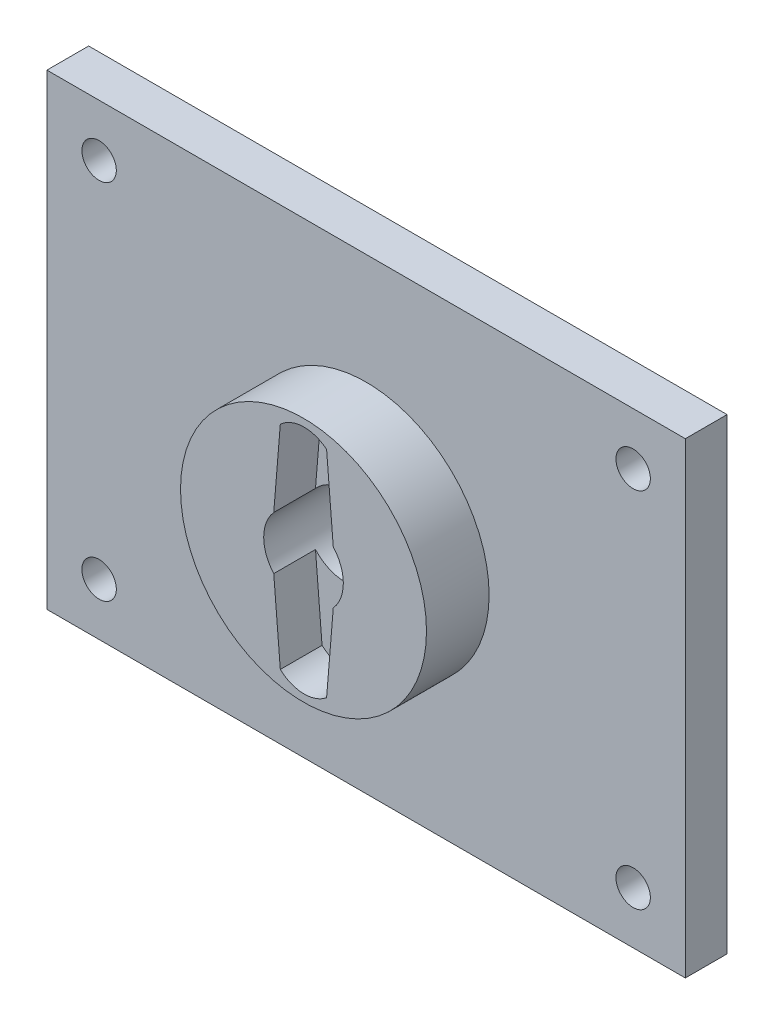
ISO-10303-21;
HEADER;
FILE_DESCRIPTION(('STEP AP214'),'2;1');
FILE_NAME('part.step','',(''),(''),'','','');
FILE_SCHEMA(('AUTOMOTIVE_DESIGN { 1 0 10303 214 1 1 1 1 }'));
ENDSEC;
DATA;
#1=APPLICATION_CONTEXT('core data for automotive mechanical design processes');
#2=APPLICATION_PROTOCOL_DEFINITION('international standard','automotive_design',2000,#1);
#3=PRODUCT_CONTEXT('',#1,'mechanical');
#4=PRODUCT('Part','Part','',(#3));
#5=PRODUCT_RELATED_PRODUCT_CATEGORY('part','',(#4));
#6=PRODUCT_DEFINITION_FORMATION('','',#4);
#7=PRODUCT_DEFINITION_CONTEXT('part definition',#1,'design');
#8=PRODUCT_DEFINITION('design','',#6,#7);
#9=PRODUCT_DEFINITION_SHAPE('','',#8);
#10=(LENGTH_UNIT() NAMED_UNIT(*) SI_UNIT(.MILLI.,.METRE.));
#11=(NAMED_UNIT(*) PLANE_ANGLE_UNIT() SI_UNIT($,.RADIAN.));
#12=(NAMED_UNIT(*) SI_UNIT($,.STERADIAN.) SOLID_ANGLE_UNIT());
#13=UNCERTAINTY_MEASURE_WITH_UNIT(LENGTH_MEASURE(1.E-05),#10,'distance_accuracy_value','');
#14=(GEOMETRIC_REPRESENTATION_CONTEXT(3) GLOBAL_UNCERTAINTY_ASSIGNED_CONTEXT((#13)) GLOBAL_UNIT_ASSIGNED_CONTEXT((#10,
#11,#12)) REPRESENTATION_CONTEXT('',''));
#15=CARTESIAN_POINT('',(0.,0.,0.));
#16=DIRECTION('',(0.,0.,1.));
#17=DIRECTION('',(1.,0.,0.));
#18=AXIS2_PLACEMENT_3D('',#15,#16,#17);
#19=CARTESIAN_POINT('',(-2.22302973270381,-10.1764153104196,6.));
#20=DIRECTION('',(-0.996638952948471,-0.0819194571867707,0.));
#21=DIRECTION('',(0.0819194571867707,-0.996638952948471,0.));
#22=AXIS2_PLACEMENT_3D('',#19,#20,#21);
#23=PLANE('',#22);
#24=DIRECTION('',(0.,0.,-1.));
#25=VECTOR('',#24,1.);
#26=CARTESIAN_POINT('',(-2.85106761194265,-2.53565405696655,10.));
#27=LINE('',#26,#25);
#28=CARTESIAN_POINT('',(-2.85106761194265,-2.53565405696655,10.));
#29=VERTEX_POINT('',#28);
#30=CARTESIAN_POINT('',(-2.85106761194265,-2.53565405696655,6.));
#31=VERTEX_POINT('',#30);
#32=EDGE_CURVE('E530',#29,#31,#27,.T.);
#33=ORIENTED_EDGE('',*,*,#32,.F.);
#34=DIRECTION('',(0.0819194571867707,-0.996638952948471,0.));
#35=VECTOR('',#34,1.);
#36=CARTESIAN_POINT('',(-2.22302973270381,-10.1764153104196,10.));
#37=LINE('',#36,#35);
#38=CARTESIAN_POINT('',(-2.22302973270381,-10.1764153104196,10.));
#39=VERTEX_POINT('',#38);
#40=EDGE_CURVE('E175',#29,#39,#37,.T.);
#41=ORIENTED_EDGE('',*,*,#40,.T.);
#42=DIRECTION('',(0.,0.,1.));
#43=VECTOR('',#42,1.);
#44=CARTESIAN_POINT('',(-2.22302973270381,-10.1764153104196,6.));
#45=LINE('',#44,#43);
#46=CARTESIAN_POINT('',(-2.22302973270381,-10.1764153104196,6.));
#47=VERTEX_POINT('',#46);
#48=EDGE_CURVE('E179',#47,#39,#45,.T.);
#49=ORIENTED_EDGE('',*,*,#48,.F.);
#50=DIRECTION('',(0.0819194571867707,-0.996638952948471,0.));
#51=VECTOR('',#50,1.);
#52=CARTESIAN_POINT('',(-2.22302973270381,-10.1764153104196,6.));
#53=LINE('',#52,#51);
#54=EDGE_CURVE('E192',#31,#47,#53,.T.);
#55=ORIENTED_EDGE('',*,*,#54,.F.);
#56=EDGE_LOOP('',(#33,#41,#49,#55));
#57=FACE_BOUND('',#56,.T.);
#58=ADVANCED_FACE('F43',(#57),#23,.F.);
#59=CARTESIAN_POINT('',(-2.22302973270416,10.1764153104192,6.));
#60=DIRECTION('',(-0.996638952948475,0.0819194571867297,0.));
#61=DIRECTION('',(-0.0819194571867297,-0.996638952948474,0.));
#62=AXIS2_PLACEMENT_3D('',#59,#60,#61);
#63=PLANE('',#62);
#64=DIRECTION('',(0.,0.,-1.));
#65=VECTOR('',#64,1.);
#66=CARTESIAN_POINT('',(-2.85106761194267,2.53565405696654,10.));
#67=LINE('',#66,#65);
#68=CARTESIAN_POINT('',(-2.85106761194266,2.53565405696654,6.));
#69=VERTEX_POINT('',#68);
#70=CARTESIAN_POINT('',(-2.85106761194266,2.53565405696654,10.));
#71=VERTEX_POINT('',#70);
#72=EDGE_CURVE('E153',#69,#71,#67,.F.);
#73=ORIENTED_EDGE('',*,*,#72,.F.);
#74=DIRECTION('',(-0.0819194571867297,-0.996638952948474,0.));
#75=VECTOR('',#74,1.);
#76=CARTESIAN_POINT('',(-2.22302973270416,10.1764153104192,6.));
#77=LINE('',#76,#75);
#78=CARTESIAN_POINT('',(-2.22302973270416,10.1764153104192,6.));
#79=VERTEX_POINT('',#78);
#80=EDGE_CURVE('E546',#79,#69,#77,.T.);
#81=ORIENTED_EDGE('',*,*,#80,.F.);
#82=DIRECTION('',(0.,0.,1.));
#83=VECTOR('',#82,1.);
#84=CARTESIAN_POINT('',(-2.22302973270416,10.1764153104192,6.));
#85=LINE('',#84,#83);
#86=CARTESIAN_POINT('',(-2.22302973270416,10.1764153104192,10.));
#87=VERTEX_POINT('',#86);
#88=EDGE_CURVE('E183',#79,#87,#85,.T.);
#89=ORIENTED_EDGE('',*,*,#88,.T.);
#90=DIRECTION('',(-0.0819194571867297,-0.996638952948474,0.));
#91=VECTOR('',#90,1.);
#92=CARTESIAN_POINT('',(-2.22302973270416,10.1764153104192,10.));
#93=LINE('',#92,#91);
#94=EDGE_CURVE('E167',#87,#71,#93,.T.);
#95=ORIENTED_EDGE('',*,*,#94,.T.);
#96=EDGE_LOOP('',(#73,#81,#89,#95));
#97=FACE_BOUND('',#96,.T.);
#98=ADVANCED_FACE('F297',(#97),#63,.F.);
#99=CARTESIAN_POINT('',(2.87019869043233,2.30290425128261,6.));
#100=DIRECTION('',(0.996638994593508,0.0819189505282011,0.));
#101=DIRECTION('',(-0.0819189505282012,0.996638994593508,0.));
#102=AXIS2_PLACEMENT_3D('',#99,#100,#101);
#103=PLANE('',#102);
#104=DIRECTION('',(0.,0.,-1.));
#105=VECTOR('',#104,1.);
#106=CARTESIAN_POINT('',(2.85106778774022,2.53565385930127,10.));
#107=LINE('',#106,#105);
#108=CARTESIAN_POINT('',(2.85106778774022,2.53565385930127,10.));
#109=VERTEX_POINT('',#108);
#110=CARTESIAN_POINT('',(2.85106778774021,2.53565385930127,6.));
#111=VERTEX_POINT('',#110);
#112=EDGE_CURVE('E61',#109,#111,#107,.T.);
#113=ORIENTED_EDGE('',*,*,#112,.F.);
#114=DIRECTION('',(-0.0819189505282011,0.996638994593508,0.));
#115=VECTOR('',#114,1.);
#116=CARTESIAN_POINT('',(2.87019869043233,2.30290425128261,10.));
#117=LINE('',#116,#115);
#118=CARTESIAN_POINT('',(2.21231952309608,10.3067669432527,10.));
#119=VERTEX_POINT('',#118);
#120=EDGE_CURVE('E149',#109,#119,#117,.T.);
#121=ORIENTED_EDGE('',*,*,#120,.T.);
#122=DIRECTION('',(0.,0.,1.));
#123=VECTOR('',#122,1.);
#124=CARTESIAN_POINT('',(2.21231952309608,10.3067669432527,6.));
#125=LINE('',#124,#123);
#126=CARTESIAN_POINT('',(2.21231952309608,10.3067669432527,6.));
#127=VERTEX_POINT('',#126);
#128=EDGE_CURVE('E186',#127,#119,#125,.T.);
#129=ORIENTED_EDGE('',*,*,#128,.F.);
#130=DIRECTION('',(-0.0819189505282011,0.996638994593508,0.));
#131=VECTOR('',#130,1.);
#132=CARTESIAN_POINT('',(2.87019869043233,2.30290425128261,6.));
#133=LINE('',#132,#131);
#134=EDGE_CURVE('E151',#111,#127,#133,.T.);
#135=ORIENTED_EDGE('',*,*,#134,.F.);
#136=EDGE_LOOP('',(#113,#121,#129,#135));
#137=FACE_BOUND('',#136,.T.);
#138=ADVANCED_FACE('F147',(#137),#103,.F.);
#139=CARTESIAN_POINT('',(2.87019869043233,-2.3029042512826,6.));
#140=DIRECTION('',(0.996638994593509,-0.0819189505281875,0.));
#141=DIRECTION('',(0.0819189505281875,0.996638994593509,0.));
#142=AXIS2_PLACEMENT_3D('',#139,#140,#141);
#143=PLANE('',#142);
#144=DIRECTION('',(0.,0.,-1.));
#145=VECTOR('',#144,1.);
#146=CARTESIAN_POINT('',(2.85106778774022,-2.53565385930126,10.));
#147=LINE('',#146,#145);
#148=CARTESIAN_POINT('',(2.85106778774022,-2.53565385930126,6.));
#149=VERTEX_POINT('',#148);
#150=CARTESIAN_POINT('',(2.85106778774022,-2.53565385930126,10.));
#151=VERTEX_POINT('',#150);
#152=EDGE_CURVE('E137',#149,#151,#147,.F.);
#153=ORIENTED_EDGE('',*,*,#152,.F.);
#154=DIRECTION('',(0.0819189505281875,0.996638994593509,0.));
#155=VECTOR('',#154,1.);
#156=CARTESIAN_POINT('',(2.87019869043233,-2.3029042512826,6.));
#157=LINE('',#156,#155);
#158=CARTESIAN_POINT('',(2.2123195230962,-10.3067669432526,6.));
#159=VERTEX_POINT('',#158);
#160=EDGE_CURVE('E536',#159,#149,#157,.T.);
#161=ORIENTED_EDGE('',*,*,#160,.F.);
#162=DIRECTION('',(0.,0.,1.));
#163=VECTOR('',#162,1.);
#164=CARTESIAN_POINT('',(2.2123195230962,-10.3067669432526,6.));
#165=LINE('',#164,#163);
#166=CARTESIAN_POINT('',(2.2123195230962,-10.3067669432526,10.));
#167=VERTEX_POINT('',#166);
#168=EDGE_CURVE('E189',#159,#167,#165,.T.);
#169=ORIENTED_EDGE('',*,*,#168,.T.);
#170=DIRECTION('',(0.0819189505281875,0.996638994593509,0.));
#171=VECTOR('',#170,1.);
#172=CARTESIAN_POINT('',(2.87019869043233,-2.3029042512826,10.));
#173=LINE('',#172,#171);
#174=EDGE_CURVE('E163',#167,#151,#173,.T.);
#175=ORIENTED_EDGE('',*,*,#174,.T.);
#176=EDGE_LOOP('',(#153,#161,#169,#175));
#177=FACE_BOUND('',#176,.T.);
#178=ADVANCED_FACE('F317',(#177),#143,.F.);
#179=CARTESIAN_POINT('',(0.0695936137938072,-7.69138338466831,6.));
#180=DIRECTION('',(0.,0.,1.));
#181=DIRECTION('',(1.,0.,0.));
#182=AXIS2_PLACEMENT_3D('',#179,#180,#181);
#183=PLANE('',#182);
#184=ORIENTED_EDGE('',*,*,#160,.T.);
#185=CARTESIAN_POINT('',(0.,0.,6.));
#186=DIRECTION('',(0.,0.,1.));
#187=DIRECTION('',(1.,0.,0.));
#188=AXIS2_PLACEMENT_3D('',#185,#186,#187);
#189=CIRCLE('',#188,3.81551150233875);
#190=EDGE_CURVE('E11',#149,#31,#189,.F.);
#191=ORIENTED_EDGE('',*,*,#190,.T.);
#192=ORIENTED_EDGE('',*,*,#54,.T.);
#193=CARTESIAN_POINT('',(0.0695936137938072,-7.69138338466831,6.));
#194=DIRECTION('',(0.,0.,1.));
#195=DIRECTION('',(1.,0.,0.));
#196=AXIS2_PLACEMENT_3D('',#193,#194,#195);
#197=CIRCLE('',#196,3.38105094325846);
#198=EDGE_CURVE('E178',#47,#159,#197,.T.);
#199=ORIENTED_EDGE('',*,*,#198,.T.);
#200=EDGE_LOOP('',(#184,#191,#192,#199));
#201=FACE_BOUND('',#200,.T.);
#202=ADVANCED_FACE('F320',(#201),#183,.T.);
#203=CARTESIAN_POINT('',(0.,0.,4.));
#204=DIRECTION('',(0.,0.,-1.));
#205=DIRECTION('',(-1.,0.,0.));
#206=AXIS2_PLACEMENT_3D('',#203,#204,#205);
#207=PLANE('',#206);
#208=CARTESIAN_POINT('',(-25.5844999291003,-17.3759992420673,4.));
#209=DIRECTION('',(0.,0.,1.));
#210=DIRECTION('',(-1.,0.,0.));
#211=AXIS2_PLACEMENT_3D('',#208,#209,#210);
#212=CIRCLE('',#211,1.65);
#213=CARTESIAN_POINT('',(-27.2344999291003,-17.3759992420673,4.));
#214=VERTEX_POINT('',#213);
#215=EDGE_CURVE('E504',#214,#214,#212,.T.);
#216=ORIENTED_EDGE('',*,*,#215,.F.);
#217=EDGE_LOOP('',(#216));
#218=FACE_BOUND('',#217,.T.);
#219=CARTESIAN_POINT('',(25.5844999291002,-17.3759992420673,4.));
#220=DIRECTION('',(0.,0.,1.));
#221=DIRECTION('',(1.,0.,0.));
#222=AXIS2_PLACEMENT_3D('',#219,#220,#221);
#223=CIRCLE('',#222,1.65);
#224=CARTESIAN_POINT('',(27.2344999291002,-17.3759992420673,4.));
#225=VERTEX_POINT('',#224);
#226=EDGE_CURVE('E508',#225,#225,#223,.T.);
#227=ORIENTED_EDGE('',*,*,#226,.F.);
#228=EDGE_LOOP('',(#227));
#229=FACE_BOUND('',#228,.T.);
#230=CARTESIAN_POINT('',(25.5844999291002,17.3759992420673,4.));
#231=DIRECTION('',(0.,0.,1.));
#232=DIRECTION('',(-1.,0.,0.));
#233=AXIS2_PLACEMENT_3D('',#230,#231,#232);
#234=CIRCLE('',#233,1.65);
#235=CARTESIAN_POINT('',(23.9344999291002,17.3759992420673,4.));
#236=VERTEX_POINT('',#235);
#237=EDGE_CURVE('E512',#236,#236,#234,.T.);
#238=ORIENTED_EDGE('',*,*,#237,.F.);
#239=EDGE_LOOP('',(#238));
#240=FACE_BOUND('',#239,.T.);
#241=CARTESIAN_POINT('',(-25.5844999291003,17.3759992420673,4.));
#242=DIRECTION('',(0.,0.,1.));
#243=DIRECTION('',(1.,0.,0.));
#244=AXIS2_PLACEMENT_3D('',#241,#242,#243);
#245=CIRCLE('',#244,1.65);
#246=CARTESIAN_POINT('',(-23.9344999291003,17.3759992420673,4.));
#247=VERTEX_POINT('',#246);
#248=EDGE_CURVE('E252',#247,#247,#245,.T.);
#249=ORIENTED_EDGE('',*,*,#248,.F.);
#250=EDGE_LOOP('',(#249));
#251=FACE_BOUND('',#250,.T.);
#252=CARTESIAN_POINT('',(0.,0.,4.));
#253=DIRECTION('',(0.,0.,-1.));
#254=DIRECTION('',(-1.,0.,0.));
#255=AXIS2_PLACEMENT_3D('',#252,#253,#254);
#256=CIRCLE('',#255,11.7834634649906);
#257=CARTESIAN_POINT('',(-11.7834634649906,0.,4.));
#258=VERTEX_POINT('',#257);
#259=EDGE_CURVE('E242',#258,#258,#256,.F.);
#260=ORIENTED_EDGE('',*,*,#259,.F.);
#261=EDGE_LOOP('',(#260));
#262=FACE_BOUND('',#261,.T.);
#263=DIRECTION('',(0.,1.,0.));
#264=VECTOR('',#263,1.);
#265=CARTESIAN_POINT('',(30.5844999291003,22.3759992420673,4.));
#266=LINE('',#265,#264);
#267=CARTESIAN_POINT('',(30.5844999291003,-22.3759992420673,4.));
#268=VERTEX_POINT('',#267);
#269=CARTESIAN_POINT('',(30.5844999291003,22.3759992420673,4.));
#270=VERTEX_POINT('',#269);
#271=EDGE_CURVE('E201',#268,#270,#266,.T.);
#272=ORIENTED_EDGE('',*,*,#271,.T.);
#273=DIRECTION('',(-1.,0.,0.));
#274=VECTOR('',#273,1.);
#275=CARTESIAN_POINT('',(30.5844999291003,22.3759992420673,4.));
#276=LINE('',#275,#274);
#277=CARTESIAN_POINT('',(-30.5844999291003,22.3759992420673,4.));
#278=VERTEX_POINT('',#277);
#279=EDGE_CURVE('E205',#270,#278,#276,.T.);
#280=ORIENTED_EDGE('',*,*,#279,.T.);
#281=DIRECTION('',(0.,-1.,0.));
#282=VECTOR('',#281,1.);
#283=CARTESIAN_POINT('',(-30.5844999291003,22.3759992420673,4.));
#284=LINE('',#283,#282);
#285=CARTESIAN_POINT('',(-30.5844999291003,-22.3759992420673,4.));
#286=VERTEX_POINT('',#285);
#287=EDGE_CURVE('E209',#278,#286,#284,.T.);
#288=ORIENTED_EDGE('',*,*,#287,.T.);
#289=DIRECTION('',(1.,0.,0.));
#290=VECTOR('',#289,1.);
#291=CARTESIAN_POINT('',(30.5844999291003,-22.3759992420673,4.));
#292=LINE('',#291,#290);
#293=EDGE_CURVE('E212',#286,#268,#292,.T.);
#294=ORIENTED_EDGE('',*,*,#293,.T.);
#295=EDGE_LOOP('',(#272,#280,#288,#294));
#296=FACE_BOUND('',#295,.T.);
#297=ADVANCED_FACE('F270',(#218,#229,#240,#251,#262,#296),#207,.F.);
#298=CARTESIAN_POINT('',(0.,0.,0.));
#299=DIRECTION('',(0.,0.,-1.));
#300=DIRECTION('',(-1.,0.,0.));
#301=AXIS2_PLACEMENT_3D('',#298,#299,#300);
#302=PLANE('',#301);
#303=CARTESIAN_POINT('',(-25.5844999291003,-17.3759992420673,0.));
#304=DIRECTION('',(0.,0.,-1.));
#305=DIRECTION('',(-1.,0.,0.));
#306=AXIS2_PLACEMENT_3D('',#303,#304,#305);
#307=CIRCLE('',#306,1.65);
#308=CARTESIAN_POINT('',(-27.2344999291003,-17.3759992420673,0.));
#309=VERTEX_POINT('',#308);
#310=EDGE_CURVE('E47',#309,#309,#307,.T.);
#311=ORIENTED_EDGE('',*,*,#310,.F.);
#312=EDGE_LOOP('',(#311));
#313=FACE_BOUND('',#312,.T.);
#314=CARTESIAN_POINT('',(25.5844999291002,-17.3759992420673,0.));
#315=DIRECTION('',(0.,0.,-1.));
#316=DIRECTION('',(-1.,0.,0.));
#317=AXIS2_PLACEMENT_3D('',#314,#315,#316);
#318=CIRCLE('',#317,1.65);
#319=CARTESIAN_POINT('',(23.9344999291002,-17.3759992420673,0.));
#320=VERTEX_POINT('',#319);
#321=EDGE_CURVE('E255',#320,#320,#318,.T.);
#322=ORIENTED_EDGE('',*,*,#321,.F.);
#323=EDGE_LOOP('',(#322));
#324=FACE_BOUND('',#323,.T.);
#325=CARTESIAN_POINT('',(25.5844999291002,17.3759992420673,0.));
#326=DIRECTION('',(0.,0.,-1.));
#327=DIRECTION('',(-1.,0.,0.));
#328=AXIS2_PLACEMENT_3D('',#325,#326,#327);
#329=CIRCLE('',#328,1.65);
#330=CARTESIAN_POINT('',(23.9344999291002,17.3759992420673,0.));
#331=VERTEX_POINT('',#330);
#332=EDGE_CURVE('E251',#331,#331,#329,.T.);
#333=ORIENTED_EDGE('',*,*,#332,.F.);
#334=EDGE_LOOP('',(#333));
#335=FACE_BOUND('',#334,.T.);
#336=CARTESIAN_POINT('',(-25.5844999291003,17.3759992420673,0.));
#337=DIRECTION('',(0.,0.,-1.));
#338=DIRECTION('',(-1.,0.,0.));
#339=AXIS2_PLACEMENT_3D('',#336,#337,#338);
#340=CIRCLE('',#339,1.65);
#341=CARTESIAN_POINT('',(-27.2344999291003,17.3759992420673,0.));
#342=VERTEX_POINT('',#341);
#343=EDGE_CURVE('E247',#342,#342,#340,.T.);
#344=ORIENTED_EDGE('',*,*,#343,.F.);
#345=EDGE_LOOP('',(#344));
#346=FACE_BOUND('',#345,.T.);
#347=DIRECTION('',(0.,1.,0.));
#348=VECTOR('',#347,1.);
#349=CARTESIAN_POINT('',(30.5844999291003,22.3759992420673,0.));
#350=LINE('',#349,#348);
#351=CARTESIAN_POINT('',(30.5844999291003,-22.3759992420673,0.));
#352=VERTEX_POINT('',#351);
#353=CARTESIAN_POINT('',(30.5844999291003,22.3759992420673,0.));
#354=VERTEX_POINT('',#353);
#355=EDGE_CURVE('E200',#352,#354,#350,.T.);
#356=ORIENTED_EDGE('',*,*,#355,.F.);
#357=DIRECTION('',(1.,0.,0.));
#358=VECTOR('',#357,1.);
#359=CARTESIAN_POINT('',(30.5844999291003,-22.3759992420673,0.));
#360=LINE('',#359,#358);
#361=CARTESIAN_POINT('',(-30.5844999291003,-22.3759992420673,0.));
#362=VERTEX_POINT('',#361);
#363=EDGE_CURVE('E206',#362,#352,#360,.T.);
#364=ORIENTED_EDGE('',*,*,#363,.F.);
#365=DIRECTION('',(0.,-1.,0.));
#366=VECTOR('',#365,1.);
#367=CARTESIAN_POINT('',(-30.5844999291003,22.3759992420673,0.));
#368=LINE('',#367,#366);
#369=CARTESIAN_POINT('',(-30.5844999291003,22.3759992420673,0.));
#370=VERTEX_POINT('',#369);
#371=EDGE_CURVE('E222',#370,#362,#368,.T.);
#372=ORIENTED_EDGE('',*,*,#371,.F.);
#373=DIRECTION('',(-1.,0.,0.));
#374=VECTOR('',#373,1.);
#375=CARTESIAN_POINT('',(30.5844999291003,22.3759992420673,0.));
#376=LINE('',#375,#374);
#377=EDGE_CURVE('E219',#354,#370,#376,.T.);
#378=ORIENTED_EDGE('',*,*,#377,.F.);
#379=EDGE_LOOP('',(#356,#364,#372,#378));
#380=FACE_BOUND('',#379,.T.);
#381=CARTESIAN_POINT('',(0.,0.,0.));
#382=DIRECTION('',(0.,0.,1.));
#383=DIRECTION('',(1.,0.,0.));
#384=AXIS2_PLACEMENT_3D('',#381,#382,#383);
#385=CIRCLE('',#384,3.81551150233875);
#386=CARTESIAN_POINT('',(3.81551150233875,0.,0.));
#387=VERTEX_POINT('',#386);
#388=EDGE_CURVE('E196',#387,#387,#385,.T.);
#389=ORIENTED_EDGE('',*,*,#388,.T.);
#390=EDGE_LOOP('',(#389));
#391=FACE_BOUND('',#390,.T.);
#392=ADVANCED_FACE('F267',(#313,#324,#335,#346,#380,#391),#302,.T.);
#393=CARTESIAN_POINT('',(30.5844999291003,22.3759992420673,4.));
#394=DIRECTION('',(-1.,0.,0.));
#395=DIRECTION('',(0.,0.,1.));
#396=AXIS2_PLACEMENT_3D('',#393,#394,#395);
#397=PLANE('',#396);
#398=ORIENTED_EDGE('',*,*,#355,.T.);
#399=DIRECTION('',(0.,0.,-1.));
#400=VECTOR('',#399,1.);
#401=CARTESIAN_POINT('',(30.5844999291003,22.3759992420673,4.));
#402=LINE('',#401,#400);
#403=EDGE_CURVE('E238',#270,#354,#402,.T.);
#404=ORIENTED_EDGE('',*,*,#403,.F.);
#405=ORIENTED_EDGE('',*,*,#271,.F.);
#406=DIRECTION('',(0.,0.,-1.));
#407=VECTOR('',#406,1.);
#408=CARTESIAN_POINT('',(30.5844999291003,-22.3759992420673,4.));
#409=LINE('',#408,#407);
#410=EDGE_CURVE('E215',#268,#352,#409,.T.);
#411=ORIENTED_EDGE('',*,*,#410,.T.);
#412=EDGE_LOOP('',(#398,#404,#405,#411));
#413=FACE_BOUND('',#412,.T.);
#414=ADVANCED_FACE('F45',(#413),#397,.F.);
#415=CARTESIAN_POINT('',(30.5844999291003,22.3759992420673,4.));
#416=DIRECTION('',(0.,-1.,0.));
#417=DIRECTION('',(0.,0.,-1.));
#418=AXIS2_PLACEMENT_3D('',#415,#416,#417);
#419=PLANE('',#418);
#420=ORIENTED_EDGE('',*,*,#377,.T.);
#421=DIRECTION('',(0.,0.,-1.));
#422=VECTOR('',#421,1.);
#423=CARTESIAN_POINT('',(-30.5844999291003,22.3759992420673,4.));
#424=LINE('',#423,#422);
#425=EDGE_CURVE('E234',#278,#370,#424,.T.);
#426=ORIENTED_EDGE('',*,*,#425,.F.);
#427=ORIENTED_EDGE('',*,*,#279,.F.);
#428=ORIENTED_EDGE('',*,*,#403,.T.);
#429=EDGE_LOOP('',(#420,#426,#427,#428));
#430=FACE_BOUND('',#429,.T.);
#431=ADVANCED_FACE('F436',(#430),#419,.F.);
#432=CARTESIAN_POINT('',(-30.5844999291003,22.3759992420673,4.));
#433=DIRECTION('',(1.,0.,0.));
#434=DIRECTION('',(0.,0.,-1.));
#435=AXIS2_PLACEMENT_3D('',#432,#433,#434);
#436=PLANE('',#435);
#437=ORIENTED_EDGE('',*,*,#371,.T.);
#438=DIRECTION('',(0.,0.,-1.));
#439=VECTOR('',#438,1.);
#440=CARTESIAN_POINT('',(-30.5844999291003,-22.3759992420673,4.));
#441=LINE('',#440,#439);
#442=EDGE_CURVE('E230',#286,#362,#441,.T.);
#443=ORIENTED_EDGE('',*,*,#442,.F.);
#444=ORIENTED_EDGE('',*,*,#287,.F.);
#445=ORIENTED_EDGE('',*,*,#425,.T.);
#446=EDGE_LOOP('',(#437,#443,#444,#445));
#447=FACE_BOUND('',#446,.T.);
#448=ADVANCED_FACE('F292',(#447),#436,.F.);
#449=CARTESIAN_POINT('',(30.5844999291003,-22.3759992420673,4.));
#450=DIRECTION('',(0.,1.,0.));
#451=DIRECTION('',(0.,0.,1.));
#452=AXIS2_PLACEMENT_3D('',#449,#450,#451);
#453=PLANE('',#452);
#454=ORIENTED_EDGE('',*,*,#363,.T.);
#455=ORIENTED_EDGE('',*,*,#410,.F.);
#456=ORIENTED_EDGE('',*,*,#293,.F.);
#457=ORIENTED_EDGE('',*,*,#442,.T.);
#458=EDGE_LOOP('',(#454,#455,#456,#457));
#459=FACE_BOUND('',#458,.T.);
#460=ADVANCED_FACE('F284',(#459),#453,.F.);
#461=CARTESIAN_POINT('',(0.,0.,4.));
#462=DIRECTION('',(0.,0.,-1.));
#463=DIRECTION('',(-1.,0.,0.));
#464=AXIS2_PLACEMENT_3D('',#461,#462,#463);
#465=CYLINDRICAL_SURFACE('',#464,3.81551150233875);
#466=ORIENTED_EDGE('',*,*,#388,.F.);
#467=EDGE_LOOP('',(#466));
#468=FACE_BOUND('',#467,.T.);
#469=ORIENTED_EDGE('',*,*,#32,.T.);
#470=ORIENTED_EDGE('',*,*,#190,.F.);
#471=ORIENTED_EDGE('',*,*,#152,.T.);
#472=CARTESIAN_POINT('',(0.,0.,10.));
#473=DIRECTION('',(0.,0.,1.));
#474=DIRECTION('',(1.,0.,0.));
#475=AXIS2_PLACEMENT_3D('',#472,#473,#474);
#476=CIRCLE('',#475,3.81551150233875);
#477=EDGE_CURVE('E134',#151,#109,#476,.T.);
#478=ORIENTED_EDGE('',*,*,#477,.T.);
#479=ORIENTED_EDGE('',*,*,#112,.T.);
#480=EDGE_CURVE('E53',#69,#111,#189,.F.);
#481=ORIENTED_EDGE('',*,*,#480,.F.);
#482=ORIENTED_EDGE('',*,*,#72,.T.);
#483=EDGE_CURVE('E143',#71,#29,#476,.T.);
#484=ORIENTED_EDGE('',*,*,#483,.T.);
#485=EDGE_LOOP('',(#469,#470,#471,#478,#479,#481,#482,#484));
#486=FACE_BOUND('',#485,.T.);
#487=ADVANCED_FACE('F135',(#468,#486),#465,.F.);
#488=CARTESIAN_POINT('',(0.,0.,10.));
#489=DIRECTION('',(0.,0.,-1.));
#490=DIRECTION('',(-1.,0.,0.));
#491=AXIS2_PLACEMENT_3D('',#488,#489,#490);
#492=CYLINDRICAL_SURFACE('',#491,11.7834634649906);
#493=CARTESIAN_POINT('',(0.,0.,10.));
#494=DIRECTION('',(0.,0.,1.));
#495=DIRECTION('',(1.,0.,0.));
#496=AXIS2_PLACEMENT_3D('',#493,#494,#495);
#497=CIRCLE('',#496,11.7834634649906);
#498=CARTESIAN_POINT('',(11.7834634649906,0.,10.));
#499=VERTEX_POINT('',#498);
#500=EDGE_CURVE('E182',#499,#499,#497,.T.);
#501=ORIENTED_EDGE('',*,*,#500,.F.);
#502=EDGE_LOOP('',(#501));
#503=FACE_BOUND('',#502,.T.);
#504=ORIENTED_EDGE('',*,*,#259,.T.);
#505=EDGE_LOOP('',(#504));
#506=FACE_BOUND('',#505,.T.);
#507=ADVANCED_FACE('F283',(#503,#506),#492,.T.);
#508=CARTESIAN_POINT('',(0.,0.,10.));
#509=DIRECTION('',(0.,0.,1.));
#510=DIRECTION('',(1.,0.,0.));
#511=AXIS2_PLACEMENT_3D('',#508,#509,#510);
#512=PLANE('',#511);
#513=ORIENTED_EDGE('',*,*,#40,.F.);
#514=ORIENTED_EDGE('',*,*,#483,.F.);
#515=ORIENTED_EDGE('',*,*,#94,.F.);
#516=CARTESIAN_POINT('',(0.0695936137938072,7.6913833846683,10.));
#517=DIRECTION('',(0.,0.,1.));
#518=DIRECTION('',(-1.,0.,0.));
#519=AXIS2_PLACEMENT_3D('',#516,#517,#518);
#520=CIRCLE('',#519,3.38105094325846);
#521=EDGE_CURVE('E161',#119,#87,#520,.T.);
#522=ORIENTED_EDGE('',*,*,#521,.F.);
#523=ORIENTED_EDGE('',*,*,#120,.F.);
#524=ORIENTED_EDGE('',*,*,#477,.F.);
#525=ORIENTED_EDGE('',*,*,#174,.F.);
#526=CARTESIAN_POINT('',(0.0695936137938072,-7.69138338466831,10.));
#527=DIRECTION('',(0.,0.,1.));
#528=DIRECTION('',(1.,0.,0.));
#529=AXIS2_PLACEMENT_3D('',#526,#527,#528);
#530=CIRCLE('',#529,3.38105094325846);
#531=EDGE_CURVE('E69',#39,#167,#530,.T.);
#532=ORIENTED_EDGE('',*,*,#531,.F.);
#533=EDGE_LOOP('',(#513,#514,#515,#522,#523,#524,#525,#532));
#534=FACE_BOUND('',#533,.T.);
#535=ORIENTED_EDGE('',*,*,#500,.T.);
#536=EDGE_LOOP('',(#535));
#537=FACE_BOUND('',#536,.T.);
#538=ADVANCED_FACE('F157',(#534,#537),#512,.T.);
#539=CARTESIAN_POINT('',(0.0695936137938072,-7.69138338466831,6.));
#540=DIRECTION('',(0.,0.,1.));
#541=DIRECTION('',(1.,0.,0.));
#542=AXIS2_PLACEMENT_3D('',#539,#540,#541);
#543=CYLINDRICAL_SURFACE('',#542,3.38105094325846);
#544=ORIENTED_EDGE('',*,*,#531,.T.);
#545=ORIENTED_EDGE('',*,*,#168,.F.);
#546=ORIENTED_EDGE('',*,*,#198,.F.);
#547=ORIENTED_EDGE('',*,*,#48,.T.);
#548=EDGE_LOOP('',(#544,#545,#546,#547));
#549=FACE_BOUND('',#548,.T.);
#550=ADVANCED_FACE('F313',(#549),#543,.F.);
#551=CARTESIAN_POINT('',(0.0695936137938072,7.6913833846683,6.));
#552=DIRECTION('',(0.,0.,1.));
#553=DIRECTION('',(1.,0.,0.));
#554=AXIS2_PLACEMENT_3D('',#551,#552,#553);
#555=CYLINDRICAL_SURFACE('',#554,3.38105094325846);
#556=ORIENTED_EDGE('',*,*,#521,.T.);
#557=ORIENTED_EDGE('',*,*,#88,.F.);
#558=CARTESIAN_POINT('',(0.0695936137938072,7.6913833846683,6.));
#559=DIRECTION('',(0.,0.,1.));
#560=DIRECTION('',(-1.,0.,0.));
#561=AXIS2_PLACEMENT_3D('',#558,#559,#560);
#562=CIRCLE('',#561,3.38105094325846);
#563=EDGE_CURVE('E542',#127,#79,#562,.T.);
#564=ORIENTED_EDGE('',*,*,#563,.F.);
#565=ORIENTED_EDGE('',*,*,#128,.T.);
#566=EDGE_LOOP('',(#556,#557,#564,#565));
#567=FACE_BOUND('',#566,.T.);
#568=ADVANCED_FACE('F310',(#567),#555,.F.);
#569=ORIENTED_EDGE('',*,*,#80,.T.);
#570=ORIENTED_EDGE('',*,*,#480,.T.);
#571=ORIENTED_EDGE('',*,*,#134,.T.);
#572=ORIENTED_EDGE('',*,*,#563,.T.);
#573=EDGE_LOOP('',(#569,#570,#571,#572));
#574=FACE_BOUND('',#573,.T.);
#575=ADVANCED_FACE('F307',(#574),#183,.T.);
#576=CARTESIAN_POINT('',(-25.5844999291003,17.3759992420673,-6.));
#577=DIRECTION('',(0.,0.,1.));
#578=DIRECTION('',(1.,0.,0.));
#579=AXIS2_PLACEMENT_3D('',#576,#577,#578);
#580=CYLINDRICAL_SURFACE('',#579,1.65);
#581=ORIENTED_EDGE('',*,*,#343,.T.);
#582=EDGE_LOOP('',(#581));
#583=FACE_BOUND('',#582,.T.);
#584=ORIENTED_EDGE('',*,*,#248,.T.);
#585=EDGE_LOOP('',(#584));
#586=FACE_BOUND('',#585,.T.);
#587=ADVANCED_FACE('F343',(#583,#586),#580,.F.);
#588=CARTESIAN_POINT('',(25.5844999291002,17.3759992420673,-6.));
#589=DIRECTION('',(0.,0.,1.));
#590=DIRECTION('',(1.,0.,0.));
#591=AXIS2_PLACEMENT_3D('',#588,#589,#590);
#592=CYLINDRICAL_SURFACE('',#591,1.65);
#593=ORIENTED_EDGE('',*,*,#332,.T.);
#594=EDGE_LOOP('',(#593));
#595=FACE_BOUND('',#594,.T.);
#596=ORIENTED_EDGE('',*,*,#237,.T.);
#597=EDGE_LOOP('',(#596));
#598=FACE_BOUND('',#597,.T.);
#599=ADVANCED_FACE('F351',(#595,#598),#592,.F.);
#600=CARTESIAN_POINT('',(25.5844999291002,-17.3759992420673,-6.));
#601=DIRECTION('',(0.,0.,1.));
#602=DIRECTION('',(1.,0.,0.));
#603=AXIS2_PLACEMENT_3D('',#600,#601,#602);
#604=CYLINDRICAL_SURFACE('',#603,1.65);
#605=ORIENTED_EDGE('',*,*,#321,.T.);
#606=EDGE_LOOP('',(#605));
#607=FACE_BOUND('',#606,.T.);
#608=ORIENTED_EDGE('',*,*,#226,.T.);
#609=EDGE_LOOP('',(#608));
#610=FACE_BOUND('',#609,.T.);
#611=ADVANCED_FACE('F359',(#607,#610),#604,.F.);
#612=CARTESIAN_POINT('',(-25.5844999291003,-17.3759992420673,-6.));
#613=DIRECTION('',(0.,0.,1.));
#614=DIRECTION('',(1.,0.,0.));
#615=AXIS2_PLACEMENT_3D('',#612,#613,#614);
#616=CYLINDRICAL_SURFACE('',#615,1.65);
#617=ORIENTED_EDGE('',*,*,#310,.T.);
#618=EDGE_LOOP('',(#617));
#619=FACE_BOUND('',#618,.T.);
#620=ORIENTED_EDGE('',*,*,#215,.T.);
#621=EDGE_LOOP('',(#620));
#622=FACE_BOUND('',#621,.T.);
#623=ADVANCED_FACE('F264',(#619,#622),#616,.F.);
#624=CLOSED_SHELL('',(#58,#98,#138,#178,#202,#297,#392,#414,#431,#448,#460,#487,#507,#538,#550,
#568,#575,#587,#599,#611,#623));
#625=MANIFOLD_SOLID_BREP('B2',#624);
#626=ADVANCED_BREP_SHAPE_REPRESENTATION('',(#18,#625),#14);
#627=SHAPE_DEFINITION_REPRESENTATION(#9,#626);
ENDSEC;
END-ISO-10303-21;
